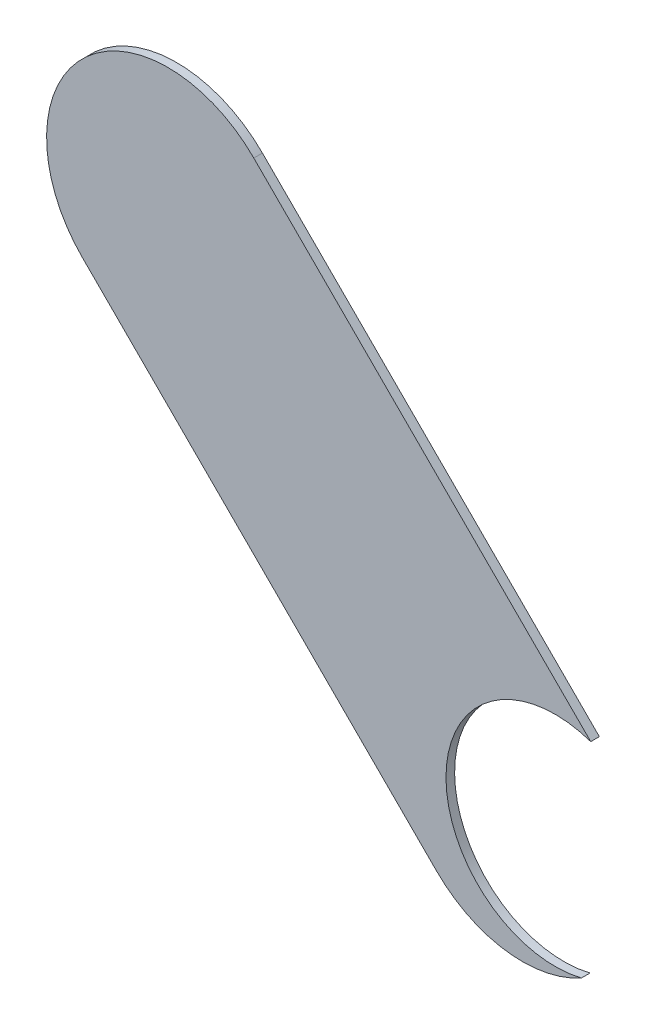
ISO-10303-21;
HEADER;
FILE_DESCRIPTION(('STEP AP214'),'2;1');
FILE_NAME('part.step','',(''),(''),'','','');
FILE_SCHEMA(('AUTOMOTIVE_DESIGN { 1 0 10303 214 1 1 1 1 }'));
ENDSEC;
DATA;
#1=APPLICATION_CONTEXT('core data for automotive mechanical design processes');
#2=APPLICATION_PROTOCOL_DEFINITION('international standard','automotive_design',2000,#1);
#3=PRODUCT_CONTEXT('',#1,'mechanical');
#4=PRODUCT('Part','Part','',(#3));
#5=PRODUCT_RELATED_PRODUCT_CATEGORY('part','',(#4));
#6=PRODUCT_DEFINITION_FORMATION('','',#4);
#7=PRODUCT_DEFINITION_CONTEXT('part definition',#1,'design');
#8=PRODUCT_DEFINITION('design','',#6,#7);
#9=PRODUCT_DEFINITION_SHAPE('','',#8);
#10=(LENGTH_UNIT() NAMED_UNIT(*) SI_UNIT(.MILLI.,.METRE.));
#11=(NAMED_UNIT(*) PLANE_ANGLE_UNIT() SI_UNIT($,.RADIAN.));
#12=(NAMED_UNIT(*) SI_UNIT($,.STERADIAN.) SOLID_ANGLE_UNIT());
#13=UNCERTAINTY_MEASURE_WITH_UNIT(LENGTH_MEASURE(1.E-05),#10,'distance_accuracy_value','');
#14=(GEOMETRIC_REPRESENTATION_CONTEXT(3) GLOBAL_UNCERTAINTY_ASSIGNED_CONTEXT((#13)) GLOBAL_UNIT_ASSIGNED_CONTEXT((#10,
#11,#12)) REPRESENTATION_CONTEXT('',''));
#15=CARTESIAN_POINT('',(0.,0.,0.));
#16=DIRECTION('',(0.,0.,1.));
#17=DIRECTION('',(1.,0.,0.));
#18=AXIS2_PLACEMENT_3D('',#15,#16,#17);
#19=CARTESIAN_POINT('',(66.95116404,42.14643844,0.));
#20=DIRECTION('',(0.707106781186548,0.707106781186548,0.));
#21=DIRECTION('',(0.707106781186548,-0.707106781186548,0.));
#22=AXIS2_PLACEMENT_3D('',#19,#20,#21);
#23=PLANE('',#22);
#24=DIRECTION('',(0.707106781186548,-0.707106781186548,0.));
#25=VECTOR('',#24,1.);
#26=CARTESIAN_POINT('',(66.95116404,42.14643844,0.03556));
#27=LINE('',#26,#25);
#28=CARTESIAN_POINT('',(66.95116404,42.14643844,0.03556));
#29=VERTEX_POINT('',#28);
#30=CARTESIAN_POINT('',(68.41115604,40.68644644,0.03556));
#31=VERTEX_POINT('',#30);
#32=EDGE_CURVE('E11',#29,#31,#27,.T.);
#33=ORIENTED_EDGE('',*,*,#32,.F.);
#34=DIRECTION('',(0.,0.,1.));
#35=VECTOR('',#34,1.);
#36=CARTESIAN_POINT('',(66.95116404,42.14643844,0.));
#37=LINE('',#36,#35);
#38=CARTESIAN_POINT('',(66.95116404,42.14643844,0.));
#39=VERTEX_POINT('',#38);
#40=EDGE_CURVE('E24',#39,#29,#37,.T.);
#41=ORIENTED_EDGE('',*,*,#40,.F.);
#42=DIRECTION('',(0.707106781186548,-0.707106781186548,0.));
#43=VECTOR('',#42,1.);
#44=CARTESIAN_POINT('',(66.95116404,42.14643844,0.));
#45=LINE('',#44,#43);
#46=CARTESIAN_POINT('',(68.41115604,40.68644644,0.));
#47=VERTEX_POINT('',#46);
#48=EDGE_CURVE('E82',#39,#47,#45,.T.);
#49=ORIENTED_EDGE('',*,*,#48,.T.);
#50=DIRECTION('',(0.,0.,1.));
#51=VECTOR('',#50,1.);
#52=CARTESIAN_POINT('',(68.41115604,40.68644644,0.));
#53=LINE('',#52,#51);
#54=EDGE_CURVE('E37',#47,#31,#53,.T.);
#55=ORIENTED_EDGE('',*,*,#54,.T.);
#56=EDGE_LOOP('',(#33,#41,#49,#55));
#57=FACE_BOUND('',#56,.T.);
#58=ADVANCED_FACE('F17',(#57),#23,.F.);
#59=CARTESIAN_POINT('',(68.7647088,41.0399992,0.));
#60=DIRECTION('',(0.,0.,-1.));
#61=DIRECTION('',(-0.707106781186548,-0.707106781186548,0.));
#62=AXIS2_PLACEMENT_3D('',#59,#60,#61);
#63=CYLINDRICAL_SURFACE('',#62,0.499999108206447);
#64=CARTESIAN_POINT('',(68.7647088,41.0399992,0.03556));
#65=DIRECTION('',(0.,0.,1.));
#66=DIRECTION('',(-0.707106781186548,-0.707106781186548,0.));
#67=AXIS2_PLACEMENT_3D('',#64,#65,#66);
#68=CIRCLE('',#67,0.499999108206447);
#69=CARTESIAN_POINT('',(69.0079099763367,40.6031327489698,0.03556));
#70=VERTEX_POINT('',#69);
#71=EDGE_CURVE('E98',#31,#70,#68,.T.);
#72=ORIENTED_EDGE('',*,*,#71,.F.);
#73=ORIENTED_EDGE('',*,*,#54,.F.);
#74=CARTESIAN_POINT('',(68.7647088,41.0399992,0.));
#75=DIRECTION('',(0.,0.,1.));
#76=DIRECTION('',(-0.707106781186548,-0.707106781186548,0.));
#77=AXIS2_PLACEMENT_3D('',#74,#75,#76);
#78=CIRCLE('',#77,0.499999108206447);
#79=CARTESIAN_POINT('',(69.0079099763367,40.6031327489698,0.));
#80=VERTEX_POINT('',#79);
#81=EDGE_CURVE('E95',#47,#80,#78,.T.);
#82=ORIENTED_EDGE('',*,*,#81,.T.);
#83=DIRECTION('',(0.,0.,1.));
#84=VECTOR('',#83,1.);
#85=CARTESIAN_POINT('',(69.0079099763367,40.6031327489698,0.));
#86=LINE('',#85,#84);
#87=EDGE_CURVE('E93',#80,#70,#86,.T.);
#88=ORIENTED_EDGE('',*,*,#87,.T.);
#89=EDGE_LOOP('',(#72,#73,#82,#88));
#90=FACE_BOUND('',#89,.T.);
#91=ADVANCED_FACE('F104',(#90),#63,.T.);
#92=CARTESIAN_POINT('',(68.8999892,41.0399992,0.));
#93=DIRECTION('',(0.,0.,-1.));
#94=DIRECTION('',(1.,0.,0.));
#95=AXIS2_PLACEMENT_3D('',#92,#93,#94);
#96=CYLINDRICAL_SURFACE('',#95,0.4499991);
#97=DIRECTION('',(0.,0.,1.));
#98=VECTOR('',#97,1.);
#99=CARTESIAN_POINT('',(69.0462464592247,41.4655670607753,0.));
#100=LINE('',#99,#98);
#101=CARTESIAN_POINT('',(69.0462464592247,41.4655670607753,0.));
#102=VERTEX_POINT('',#101);
#103=CARTESIAN_POINT('',(69.0462464592247,41.4655670607753,0.03556));
#104=VERTEX_POINT('',#103);
#105=EDGE_CURVE('E73',#102,#104,#100,.T.);
#106=ORIENTED_EDGE('',*,*,#105,.T.);
#107=CARTESIAN_POINT('',(68.8999892,41.0399992,0.03556));
#108=DIRECTION('',(0.,0.,1.));
#109=DIRECTION('',(1.,0.,0.));
#110=AXIS2_PLACEMENT_3D('',#107,#108,#109);
#111=CIRCLE('',#110,0.4499991);
#112=EDGE_CURVE('E89',#104,#70,#111,.T.);
#113=ORIENTED_EDGE('',*,*,#112,.T.);
#114=ORIENTED_EDGE('',*,*,#87,.F.);
#115=CARTESIAN_POINT('',(68.8999892,41.0399992,0.));
#116=DIRECTION('',(0.,0.,1.));
#117=DIRECTION('',(1.,0.,0.));
#118=AXIS2_PLACEMENT_3D('',#115,#116,#117);
#119=CIRCLE('',#118,0.4499991);
#120=EDGE_CURVE('E87',#102,#80,#119,.T.);
#121=ORIENTED_EDGE('',*,*,#120,.F.);
#122=EDGE_LOOP('',(#106,#113,#114,#121));
#123=FACE_BOUND('',#122,.T.);
#124=ADVANCED_FACE('F109',(#123),#96,.F.);
#125=CARTESIAN_POINT('',(69.0462464592247,41.4655670607753,0.));
#126=DIRECTION('',(-0.707106781186542,-0.707106781186553,0.));
#127=DIRECTION('',(-0.707106781186553,0.707106781186542,0.));
#128=AXIS2_PLACEMENT_3D('',#125,#126,#127);
#129=PLANE('',#128);
#130=DIRECTION('',(-0.707106781186553,0.707106781186542,0.));
#131=VECTOR('',#130,1.);
#132=CARTESIAN_POINT('',(69.11826156,41.39355196,0.03556));
#133=LINE('',#132,#131);
#134=CARTESIAN_POINT('',(67.65826956,42.85354396,0.03556));
#135=VERTEX_POINT('',#134);
#136=EDGE_CURVE('E77',#104,#135,#133,.T.);
#137=ORIENTED_EDGE('',*,*,#136,.F.);
#138=ORIENTED_EDGE('',*,*,#105,.F.);
#139=DIRECTION('',(-0.707106781186553,0.707106781186542,0.));
#140=VECTOR('',#139,1.);
#141=CARTESIAN_POINT('',(69.11826156,41.39355196,0.));
#142=LINE('',#141,#140);
#143=CARTESIAN_POINT('',(67.65826956,42.85354396,0.));
#144=VERTEX_POINT('',#143);
#145=EDGE_CURVE('E69',#102,#144,#142,.T.);
#146=ORIENTED_EDGE('',*,*,#145,.T.);
#147=DIRECTION('',(0.,0.,1.));
#148=VECTOR('',#147,1.);
#149=CARTESIAN_POINT('',(67.65826956,42.85354396,0.));
#150=LINE('',#149,#148);
#151=EDGE_CURVE('E59',#144,#135,#150,.T.);
#152=ORIENTED_EDGE('',*,*,#151,.T.);
#153=EDGE_LOOP('',(#137,#138,#146,#152));
#154=FACE_BOUND('',#153,.T.);
#155=ADVANCED_FACE('F72',(#154),#129,.F.);
#156=CARTESIAN_POINT('',(67.3047168,42.4999912,0.));
#157=DIRECTION('',(0.,0.,-1.));
#158=DIRECTION('',(0.707106781186548,0.707106781186548,0.));
#159=AXIS2_PLACEMENT_3D('',#156,#157,#158);
#160=CYLINDRICAL_SURFACE('',#159,0.499999108206439);
#161=CARTESIAN_POINT('',(67.3047168,42.4999912,0.03556));
#162=DIRECTION('',(0.,0.,1.));
#163=DIRECTION('',(0.707106781186548,0.707106781186548,0.));
#164=AXIS2_PLACEMENT_3D('',#161,#162,#163);
#165=CIRCLE('',#164,0.499999108206439);
#166=EDGE_CURVE('E65',#135,#29,#165,.T.);
#167=ORIENTED_EDGE('',*,*,#166,.F.);
#168=ORIENTED_EDGE('',*,*,#151,.F.);
#169=CARTESIAN_POINT('',(67.3047168,42.4999912,0.));
#170=DIRECTION('',(0.,0.,1.));
#171=DIRECTION('',(0.707106781186548,0.707106781186548,0.));
#172=AXIS2_PLACEMENT_3D('',#169,#170,#171);
#173=CIRCLE('',#172,0.499999108206439);
#174=EDGE_CURVE('E63',#144,#39,#173,.T.);
#175=ORIENTED_EDGE('',*,*,#174,.T.);
#176=ORIENTED_EDGE('',*,*,#40,.T.);
#177=EDGE_LOOP('',(#167,#168,#175,#176));
#178=FACE_BOUND('',#177,.T.);
#179=ADVANCED_FACE('F61',(#178),#160,.T.);
#180=CARTESIAN_POINT('',(66.95116404,42.14643844,0.));
#181=DIRECTION('',(0.,0.,-1.));
#182=DIRECTION('',(-1.,0.,0.));
#183=AXIS2_PLACEMENT_3D('',#180,#181,#182);
#184=PLANE('',#183);
#185=ORIENTED_EDGE('',*,*,#48,.F.);
#186=ORIENTED_EDGE('',*,*,#174,.F.);
#187=ORIENTED_EDGE('',*,*,#145,.F.);
#188=ORIENTED_EDGE('',*,*,#120,.T.);
#189=ORIENTED_EDGE('',*,*,#81,.F.);
#190=EDGE_LOOP('',(#185,#186,#187,#188,#189));
#191=FACE_BOUND('',#190,.T.);
#192=ADVANCED_FACE('F80',(#191),#184,.T.);
#193=CARTESIAN_POINT('',(66.95116404,42.14643844,0.03556));
#194=DIRECTION('',(0.,0.,-1.));
#195=DIRECTION('',(-1.,0.,0.));
#196=AXIS2_PLACEMENT_3D('',#193,#194,#195);
#197=PLANE('',#196);
#198=ORIENTED_EDGE('',*,*,#166,.T.);
#199=ORIENTED_EDGE('',*,*,#32,.T.);
#200=ORIENTED_EDGE('',*,*,#71,.T.);
#201=ORIENTED_EDGE('',*,*,#112,.F.);
#202=ORIENTED_EDGE('',*,*,#136,.T.);
#203=EDGE_LOOP('',(#198,#199,#200,#201,#202));
#204=FACE_BOUND('',#203,.T.);
#205=ADVANCED_FACE('F107',(#204),#197,.F.);
#206=CLOSED_SHELL('',(#58,#91,#124,#155,#179,#192,#205));
#207=MANIFOLD_SOLID_BREP('B1',#206);
#208=ADVANCED_BREP_SHAPE_REPRESENTATION('',(#18,#207),#14);
#209=SHAPE_DEFINITION_REPRESENTATION(#9,#208);
ENDSEC;
END-ISO-10303-21;
